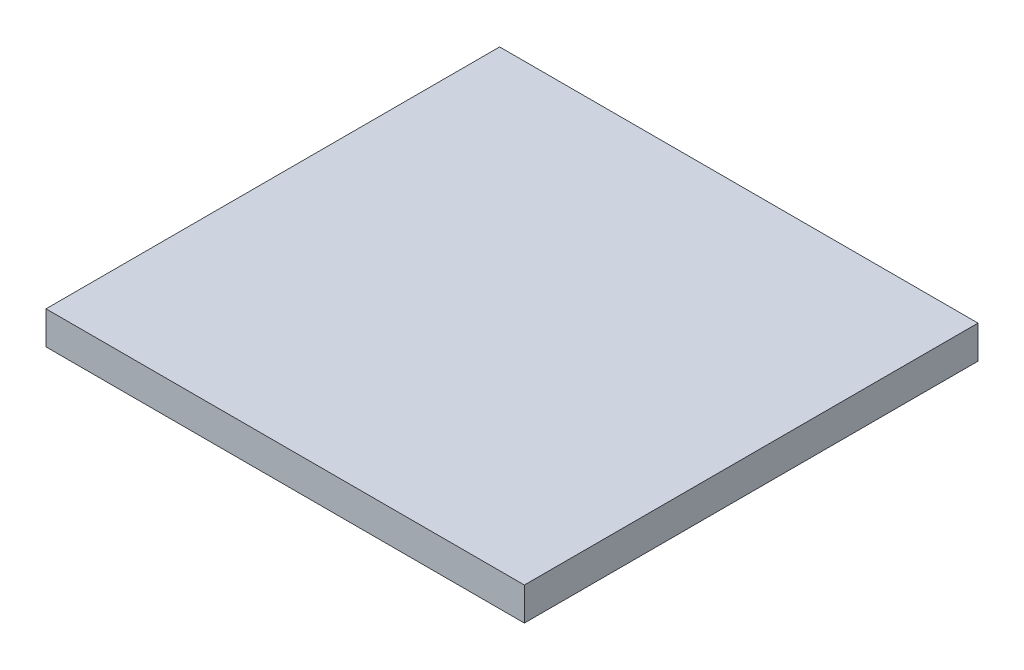
ISO-10303-21;
HEADER;
FILE_DESCRIPTION(('STEP AP214'),'2;1');
FILE_NAME('part.step','',(''),(''),'','','');
FILE_SCHEMA(('AUTOMOTIVE_DESIGN { 1 0 10303 214 1 1 1 1 }'));
ENDSEC;
DATA;
#1=APPLICATION_CONTEXT('core data for automotive mechanical design processes');
#2=APPLICATION_PROTOCOL_DEFINITION('international standard','automotive_design',2000,#1);
#3=PRODUCT_CONTEXT('',#1,'mechanical');
#4=PRODUCT('Part','Part','',(#3));
#5=PRODUCT_RELATED_PRODUCT_CATEGORY('part','',(#4));
#6=PRODUCT_DEFINITION_FORMATION('','',#4);
#7=PRODUCT_DEFINITION_CONTEXT('part definition',#1,'design');
#8=PRODUCT_DEFINITION('design','',#6,#7);
#9=PRODUCT_DEFINITION_SHAPE('','',#8);
#10=(LENGTH_UNIT() NAMED_UNIT(*) SI_UNIT(.MILLI.,.METRE.));
#11=(NAMED_UNIT(*) PLANE_ANGLE_UNIT() SI_UNIT($,.RADIAN.));
#12=(NAMED_UNIT(*) SI_UNIT($,.STERADIAN.) SOLID_ANGLE_UNIT());
#13=UNCERTAINTY_MEASURE_WITH_UNIT(LENGTH_MEASURE(1.E-05),#10,'distance_accuracy_value','');
#14=(GEOMETRIC_REPRESENTATION_CONTEXT(3) GLOBAL_UNCERTAINTY_ASSIGNED_CONTEXT((#13)) GLOBAL_UNIT_ASSIGNED_CONTEXT((#10,
#11,#12)) REPRESENTATION_CONTEXT('',''));
#15=CARTESIAN_POINT('',(0.,0.,0.));
#16=DIRECTION('',(0.,0.,1.));
#17=DIRECTION('',(1.,0.,0.));
#18=AXIS2_PLACEMENT_3D('',#15,#16,#17);
#19=CARTESIAN_POINT('',(60.,822.,-580.));
#20=DIRECTION('',(-1.,0.,0.));
#21=DIRECTION('',(0.,0.,1.));
#22=AXIS2_PLACEMENT_3D('',#19,#20,#21);
#23=PLANE('',#22);
#24=DIRECTION('',(0.,-1.,0.));
#25=VECTOR('',#24,1.);
#26=CARTESIAN_POINT('',(60.,822.,-30.));
#27=LINE('',#26,#25);
#28=CARTESIAN_POINT('',(60.,862.,-30.));
#29=VERTEX_POINT('',#28);
#30=CARTESIAN_POINT('',(60.,822.,-30.));
#31=VERTEX_POINT('',#30);
#32=EDGE_CURVE('E103',#29,#31,#27,.T.);
#33=ORIENTED_EDGE('',*,*,#32,.F.);
#34=DIRECTION('',(0.,0.,1.));
#35=VECTOR('',#34,1.);
#36=CARTESIAN_POINT('',(60.,862.,-580.));
#37=LINE('',#36,#35);
#38=CARTESIAN_POINT('',(60.,862.,-580.));
#39=VERTEX_POINT('',#38);
#40=EDGE_CURVE('E11',#39,#29,#37,.T.);
#41=ORIENTED_EDGE('',*,*,#40,.F.);
#42=DIRECTION('',(0.,-1.,0.));
#43=VECTOR('',#42,1.);
#44=CARTESIAN_POINT('',(60.,822.,-580.));
#45=LINE('',#44,#43);
#46=CARTESIAN_POINT('',(60.,822.,-580.));
#47=VERTEX_POINT('',#46);
#48=EDGE_CURVE('E97',#39,#47,#45,.T.);
#49=ORIENTED_EDGE('',*,*,#48,.T.);
#50=DIRECTION('',(0.,0.,1.));
#51=VECTOR('',#50,1.);
#52=CARTESIAN_POINT('',(60.,822.,-580.));
#53=LINE('',#52,#51);
#54=EDGE_CURVE('E42',#47,#31,#53,.T.);
#55=ORIENTED_EDGE('',*,*,#54,.T.);
#56=EDGE_LOOP('',(#33,#41,#49,#55));
#57=FACE_BOUND('',#56,.T.);
#58=ADVANCED_FACE('F39',(#57),#23,.T.);
#59=CARTESIAN_POINT('',(60.,862.,-580.));
#60=DIRECTION('',(0.,1.,0.));
#61=DIRECTION('',(0.,0.,1.));
#62=AXIS2_PLACEMENT_3D('',#59,#60,#61);
#63=PLANE('',#62);
#64=DIRECTION('',(-1.,0.,0.));
#65=VECTOR('',#64,1.);
#66=CARTESIAN_POINT('',(60.,862.,-30.));
#67=LINE('',#66,#65);
#68=CARTESIAN_POINT('',(640.,862.,-30.));
#69=VERTEX_POINT('',#68);
#70=EDGE_CURVE('E99',#69,#29,#67,.T.);
#71=ORIENTED_EDGE('',*,*,#70,.F.);
#72=DIRECTION('',(0.,0.,1.));
#73=VECTOR('',#72,1.);
#74=CARTESIAN_POINT('',(640.,862.,-580.));
#75=LINE('',#74,#73);
#76=CARTESIAN_POINT('',(640.,862.,-580.));
#77=VERTEX_POINT('',#76);
#78=EDGE_CURVE('E48',#77,#69,#75,.T.);
#79=ORIENTED_EDGE('',*,*,#78,.F.);
#80=DIRECTION('',(-1.,0.,0.));
#81=VECTOR('',#80,1.);
#82=CARTESIAN_POINT('',(60.,862.,-580.));
#83=LINE('',#82,#81);
#84=EDGE_CURVE('E94',#77,#39,#83,.T.);
#85=ORIENTED_EDGE('',*,*,#84,.T.);
#86=ORIENTED_EDGE('',*,*,#40,.T.);
#87=EDGE_LOOP('',(#71,#79,#85,#86));
#88=FACE_BOUND('',#87,.T.);
#89=ADVANCED_FACE('F113',(#88),#63,.T.);
#90=CARTESIAN_POINT('',(640.,822.,-580.));
#91=DIRECTION('',(1.,0.,0.));
#92=DIRECTION('',(0.,0.,-1.));
#93=AXIS2_PLACEMENT_3D('',#90,#91,#92);
#94=PLANE('',#93);
#95=DIRECTION('',(0.,1.,0.));
#96=VECTOR('',#95,1.);
#97=CARTESIAN_POINT('',(640.,822.,-30.));
#98=LINE('',#97,#96);
#99=CARTESIAN_POINT('',(640.,822.,-30.));
#100=VERTEX_POINT('',#99);
#101=EDGE_CURVE('E89',#100,#69,#98,.T.);
#102=ORIENTED_EDGE('',*,*,#101,.F.);
#103=DIRECTION('',(0.,0.,1.));
#104=VECTOR('',#103,1.);
#105=CARTESIAN_POINT('',(640.,822.,-580.));
#106=LINE('',#105,#104);
#107=CARTESIAN_POINT('',(640.,822.,-580.));
#108=VERTEX_POINT('',#107);
#109=EDGE_CURVE('E84',#108,#100,#106,.T.);
#110=ORIENTED_EDGE('',*,*,#109,.F.);
#111=DIRECTION('',(0.,1.,0.));
#112=VECTOR('',#111,1.);
#113=CARTESIAN_POINT('',(640.,822.,-580.));
#114=LINE('',#113,#112);
#115=EDGE_CURVE('E87',#108,#77,#114,.T.);
#116=ORIENTED_EDGE('',*,*,#115,.T.);
#117=ORIENTED_EDGE('',*,*,#78,.T.);
#118=EDGE_LOOP('',(#102,#110,#116,#117));
#119=FACE_BOUND('',#118,.T.);
#120=ADVANCED_FACE('F86',(#119),#94,.T.);
#121=CARTESIAN_POINT('',(60.,822.,-580.));
#122=DIRECTION('',(0.,-1.,0.));
#123=DIRECTION('',(0.,0.,-1.));
#124=AXIS2_PLACEMENT_3D('',#121,#122,#123);
#125=PLANE('',#124);
#126=DIRECTION('',(1.,0.,0.));
#127=VECTOR('',#126,1.);
#128=CARTESIAN_POINT('',(60.,822.,-30.));
#129=LINE('',#128,#127);
#130=EDGE_CURVE('E106',#31,#100,#129,.T.);
#131=ORIENTED_EDGE('',*,*,#130,.F.);
#132=ORIENTED_EDGE('',*,*,#54,.F.);
#133=DIRECTION('',(1.,0.,0.));
#134=VECTOR('',#133,1.);
#135=CARTESIAN_POINT('',(60.,822.,-580.));
#136=LINE('',#135,#134);
#137=EDGE_CURVE('E93',#47,#108,#136,.T.);
#138=ORIENTED_EDGE('',*,*,#137,.T.);
#139=ORIENTED_EDGE('',*,*,#109,.T.);
#140=EDGE_LOOP('',(#131,#132,#138,#139));
#141=FACE_BOUND('',#140,.T.);
#142=ADVANCED_FACE('F96',(#141),#125,.T.);
#143=CARTESIAN_POINT('',(0.,0.,-580.));
#144=DIRECTION('',(0.,0.,-1.));
#145=DIRECTION('',(-1.,0.,0.));
#146=AXIS2_PLACEMENT_3D('',#143,#144,#145);
#147=PLANE('',#146);
#148=ORIENTED_EDGE('',*,*,#48,.F.);
#149=ORIENTED_EDGE('',*,*,#84,.F.);
#150=ORIENTED_EDGE('',*,*,#115,.F.);
#151=ORIENTED_EDGE('',*,*,#137,.F.);
#152=EDGE_LOOP('',(#148,#149,#150,#151));
#153=FACE_BOUND('',#152,.T.);
#154=ADVANCED_FACE('F92',(#153),#147,.T.);
#155=CARTESIAN_POINT('',(0.,0.,-30.));
#156=DIRECTION('',(0.,0.,-1.));
#157=DIRECTION('',(-1.,0.,0.));
#158=AXIS2_PLACEMENT_3D('',#155,#156,#157);
#159=PLANE('',#158);
#160=ORIENTED_EDGE('',*,*,#32,.T.);
#161=ORIENTED_EDGE('',*,*,#130,.T.);
#162=ORIENTED_EDGE('',*,*,#101,.T.);
#163=ORIENTED_EDGE('',*,*,#70,.T.);
#164=EDGE_LOOP('',(#160,#161,#162,#163));
#165=FACE_BOUND('',#164,.T.);
#166=ADVANCED_FACE('F112',(#165),#159,.F.);
#167=CLOSED_SHELL('',(#58,#89,#120,#142,#154,#166));
#168=MANIFOLD_SOLID_BREP('B2',#167);
#169=ADVANCED_BREP_SHAPE_REPRESENTATION('',(#18,#168),#14);
#170=SHAPE_DEFINITION_REPRESENTATION(#9,#169);
ENDSEC;
END-ISO-10303-21;
